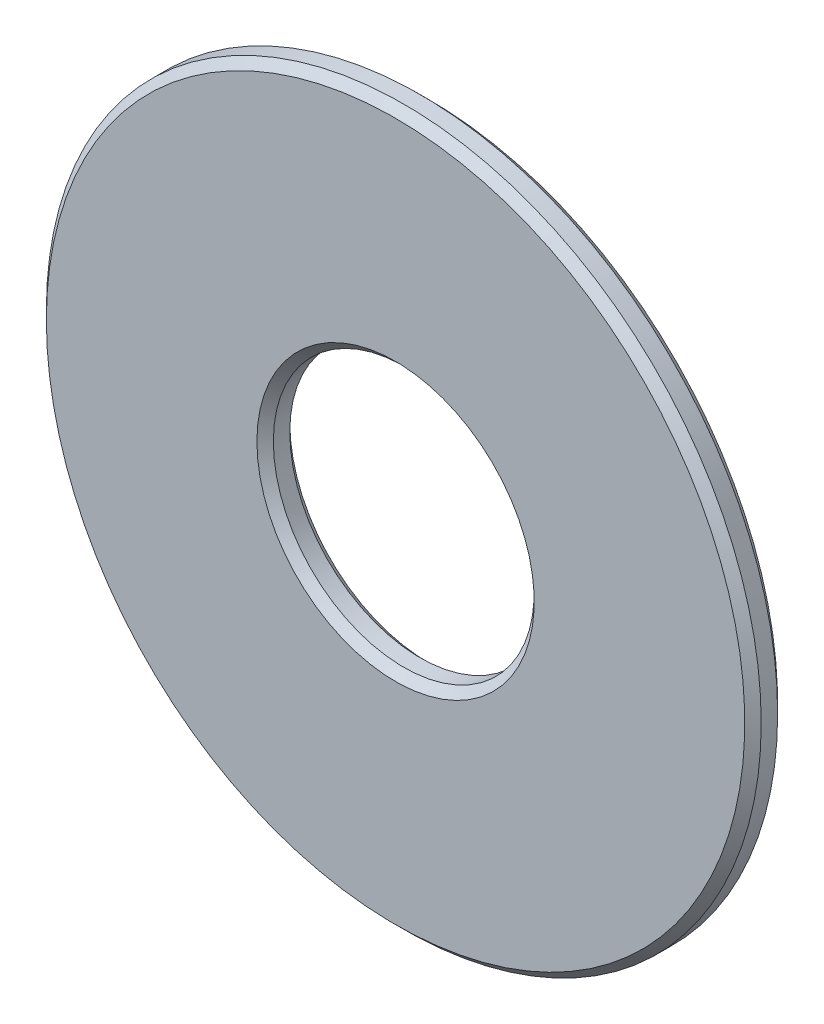
ISO-10303-21;
HEADER;
FILE_DESCRIPTION(('STEP AP214'),'2;1');
FILE_NAME('part.step','',(''),(''),'','','');
FILE_SCHEMA(('AUTOMOTIVE_DESIGN { 1 0 10303 214 1 1 1 1 }'));
ENDSEC;
DATA;
#1=APPLICATION_CONTEXT('core data for automotive mechanical design processes');
#2=APPLICATION_PROTOCOL_DEFINITION('international standard','automotive_design',2000,#1);
#3=PRODUCT_CONTEXT('',#1,'mechanical');
#4=PRODUCT('Part','Part','',(#3));
#5=PRODUCT_RELATED_PRODUCT_CATEGORY('part','',(#4));
#6=PRODUCT_DEFINITION_FORMATION('','',#4);
#7=PRODUCT_DEFINITION_CONTEXT('part definition',#1,'design');
#8=PRODUCT_DEFINITION('design','',#6,#7);
#9=PRODUCT_DEFINITION_SHAPE('','',#8);
#10=(LENGTH_UNIT() NAMED_UNIT(*) SI_UNIT(.MILLI.,.METRE.));
#11=(NAMED_UNIT(*) PLANE_ANGLE_UNIT() SI_UNIT($,.RADIAN.));
#12=(NAMED_UNIT(*) SI_UNIT($,.STERADIAN.) SOLID_ANGLE_UNIT());
#13=UNCERTAINTY_MEASURE_WITH_UNIT(LENGTH_MEASURE(1.E-05),#10,'distance_accuracy_value','');
#14=(GEOMETRIC_REPRESENTATION_CONTEXT(3) GLOBAL_UNCERTAINTY_ASSIGNED_CONTEXT((#13)) GLOBAL_UNIT_ASSIGNED_CONTEXT((#10,
#11,#12)) REPRESENTATION_CONTEXT('',''));
#15=CARTESIAN_POINT('',(0.,0.,0.));
#16=DIRECTION('',(0.,0.,1.));
#17=DIRECTION('',(1.,0.,0.));
#18=AXIS2_PLACEMENT_3D('',#15,#16,#17);
#19=CARTESIAN_POINT('',(86.6025403784436,141.049999999714,366.574757541018));
#20=DIRECTION('',(0.,0.,1.));
#21=DIRECTION('',(-1.,0.,0.));
#22=AXIS2_PLACEMENT_3D('',#19,#20,#21);
#23=CONICAL_SURFACE('',#22,3.375,0.7853981625);
#24=CARTESIAN_POINT('',(86.6025403784436,141.049999999714,366.574757541018));
#25=DIRECTION('',(0.,0.,-1.));
#26=DIRECTION('',(-1.,0.,0.));
#27=AXIS2_PLACEMENT_3D('',#24,#25,#26);
#28=CIRCLE('',#27,3.375);
#29=CARTESIAN_POINT('',(83.2275403784436,141.049999999714,366.574757541018));
#30=VERTEX_POINT('',#29);
#31=EDGE_CURVE('E78',#30,#30,#28,.T.);
#32=ORIENTED_EDGE('',*,*,#31,.F.);
#33=EDGE_LOOP('',(#32));
#34=FACE_BOUND('',#33,.T.);
#35=CARTESIAN_POINT('',(86.6025403784436,141.049999999714,366.374757541018));
#36=DIRECTION('',(0.,0.,1.));
#37=DIRECTION('',(-1.,0.,0.));
#38=AXIS2_PLACEMENT_3D('',#35,#36,#37);
#39=CIRCLE('',#38,3.175);
#40=CARTESIAN_POINT('',(83.4275403784436,141.049999999714,366.374757541018));
#41=VERTEX_POINT('',#40);
#42=EDGE_CURVE('E79',#41,#41,#39,.T.);
#43=ORIENTED_EDGE('',*,*,#42,.F.);
#44=EDGE_LOOP('',(#43));
#45=FACE_BOUND('',#44,.T.);
#46=ADVANCED_FACE('F43',(#34,#45),#23,.F.);
#47=CARTESIAN_POINT('',(86.6025403784436,141.049999999714,366.574757541018));
#48=DIRECTION('',(0.,0.,-1.));
#49=DIRECTION('',(1.,0.,0.));
#50=AXIS2_PLACEMENT_3D('',#47,#48,#49);
#51=CONICAL_SURFACE('',#50,8.5,0.785398162499974);
#52=CARTESIAN_POINT('',(86.6025403784436,141.049999999714,366.574757541018));
#53=DIRECTION('',(0.,0.,1.));
#54=DIRECTION('',(-1.,0.,0.));
#55=AXIS2_PLACEMENT_3D('',#52,#53,#54);
#56=CIRCLE('',#55,8.5);
#57=CARTESIAN_POINT('',(78.1025403784436,141.049999999714,366.574757541018));
#58=VERTEX_POINT('',#57);
#59=EDGE_CURVE('E75',#58,#58,#56,.T.);
#60=ORIENTED_EDGE('',*,*,#59,.F.);
#61=EDGE_LOOP('',(#60));
#62=FACE_BOUND('',#61,.T.);
#63=CARTESIAN_POINT('',(86.6025403784436,141.049999999714,366.374757541018));
#64=DIRECTION('',(0.,0.,-1.));
#65=DIRECTION('',(-1.,0.,0.));
#66=AXIS2_PLACEMENT_3D('',#63,#64,#65);
#67=CIRCLE('',#66,8.7);
#68=CARTESIAN_POINT('',(77.9025403784436,141.049999999714,366.374757541018));
#69=VERTEX_POINT('',#68);
#70=EDGE_CURVE('E86',#69,#69,#67,.T.);
#71=ORIENTED_EDGE('',*,*,#70,.F.);
#72=EDGE_LOOP('',(#71));
#73=FACE_BOUND('',#72,.T.);
#74=ADVANCED_FACE('F104',(#62,#73),#51,.T.);
#75=CARTESIAN_POINT('',(86.6025403784436,141.049999999714,365.974757541019));
#76=DIRECTION('',(0.,0.,-1.));
#77=DIRECTION('',(1.,0.,0.));
#78=AXIS2_PLACEMENT_3D('',#75,#76,#77);
#79=CONICAL_SURFACE('',#78,3.175,0.7853981625);
#80=CARTESIAN_POINT('',(86.6025403784436,141.049999999714,365.974757541019));
#81=DIRECTION('',(0.,0.,-1.));
#82=DIRECTION('',(-1.,0.,0.));
#83=AXIS2_PLACEMENT_3D('',#80,#81,#82);
#84=CIRCLE('',#83,3.175);
#85=CARTESIAN_POINT('',(83.4275403784436,141.049999999714,365.974757541019));
#86=VERTEX_POINT('',#85);
#87=EDGE_CURVE('E82',#86,#86,#84,.T.);
#88=ORIENTED_EDGE('',*,*,#87,.F.);
#89=EDGE_LOOP('',(#88));
#90=FACE_BOUND('',#89,.T.);
#91=CARTESIAN_POINT('',(86.6025403784436,141.049999999714,365.774757541019));
#92=DIRECTION('',(0.,0.,1.));
#93=DIRECTION('',(-1.,0.,0.));
#94=AXIS2_PLACEMENT_3D('',#91,#92,#93);
#95=CIRCLE('',#94,3.375);
#96=CARTESIAN_POINT('',(83.2275403784436,141.049999999714,365.774757541019));
#97=VERTEX_POINT('',#96);
#98=EDGE_CURVE('E11',#97,#97,#95,.T.);
#99=ORIENTED_EDGE('',*,*,#98,.F.);
#100=EDGE_LOOP('',(#99));
#101=FACE_BOUND('',#100,.T.);
#102=ADVANCED_FACE('F95',(#90,#101),#79,.F.);
#103=CARTESIAN_POINT('',(86.6025403784436,141.049999999714,365.974757541019));
#104=DIRECTION('',(0.,0.,1.));
#105=DIRECTION('',(-1.,0.,0.));
#106=AXIS2_PLACEMENT_3D('',#103,#104,#105);
#107=CONICAL_SURFACE('',#106,8.7,0.785398162499974);
#108=CARTESIAN_POINT('',(86.6025403784436,141.049999999714,365.974757541019));
#109=DIRECTION('',(0.,0.,1.));
#110=DIRECTION('',(-1.,0.,0.));
#111=AXIS2_PLACEMENT_3D('',#108,#109,#110);
#112=CIRCLE('',#111,8.7);
#113=CARTESIAN_POINT('',(77.9025403784436,141.049999999714,365.974757541019));
#114=VERTEX_POINT('',#113);
#115=EDGE_CURVE('E47',#114,#114,#112,.T.);
#116=ORIENTED_EDGE('',*,*,#115,.F.);
#117=EDGE_LOOP('',(#116));
#118=FACE_BOUND('',#117,.T.);
#119=CARTESIAN_POINT('',(86.6025403784436,141.049999999714,365.774757541019));
#120=DIRECTION('',(0.,0.,-1.));
#121=DIRECTION('',(-1.,0.,0.));
#122=AXIS2_PLACEMENT_3D('',#119,#120,#121);
#123=CIRCLE('',#122,8.5);
#124=CARTESIAN_POINT('',(78.1025403784436,141.049999999714,365.774757541019));
#125=VERTEX_POINT('',#124);
#126=EDGE_CURVE('E53',#125,#125,#123,.T.);
#127=ORIENTED_EDGE('',*,*,#126,.F.);
#128=EDGE_LOOP('',(#127));
#129=FACE_BOUND('',#128,.T.);
#130=ADVANCED_FACE('F93',(#118,#129),#107,.T.);
#131=CARTESIAN_POINT('',(86.6025403784436,141.049999999714,365.774757541019));
#132=DIRECTION('',(0.,0.,1.));
#133=DIRECTION('',(1.,0.,0.));
#134=AXIS2_PLACEMENT_3D('',#131,#132,#133);
#135=PLANE('',#134);
#136=ORIENTED_EDGE('',*,*,#98,.T.);
#137=EDGE_LOOP('',(#136));
#138=FACE_BOUND('',#137,.T.);
#139=ORIENTED_EDGE('',*,*,#126,.T.);
#140=EDGE_LOOP('',(#139));
#141=FACE_BOUND('',#140,.T.);
#142=ADVANCED_FACE('F91',(#138,#141),#135,.F.);
#143=CARTESIAN_POINT('',(86.6025403784436,141.049999999714,366.574757541018));
#144=DIRECTION('',(0.,0.,1.));
#145=DIRECTION('',(1.,0.,0.));
#146=AXIS2_PLACEMENT_3D('',#143,#144,#145);
#147=PLANE('',#146);
#148=ORIENTED_EDGE('',*,*,#31,.T.);
#149=EDGE_LOOP('',(#148));
#150=FACE_BOUND('',#149,.T.);
#151=ORIENTED_EDGE('',*,*,#59,.T.);
#152=EDGE_LOOP('',(#151));
#153=FACE_BOUND('',#152,.T.);
#154=ADVANCED_FACE('F76',(#150,#153),#147,.T.);
#155=CARTESIAN_POINT('',(86.6025403784436,141.049999999714,366.574757541018));
#156=DIRECTION('',(0.,0.,-1.));
#157=DIRECTION('',(1.,0.,0.));
#158=AXIS2_PLACEMENT_3D('',#155,#156,#157);
#159=CYLINDRICAL_SURFACE('',#158,3.175);
#160=ORIENTED_EDGE('',*,*,#42,.T.);
#161=EDGE_LOOP('',(#160));
#162=FACE_BOUND('',#161,.T.);
#163=ORIENTED_EDGE('',*,*,#87,.T.);
#164=EDGE_LOOP('',(#163));
#165=FACE_BOUND('',#164,.T.);
#166=ADVANCED_FACE('F120',(#162,#165),#159,.F.);
#167=CARTESIAN_POINT('',(86.6025403784436,141.049999999714,366.574757541018));
#168=DIRECTION('',(0.,0.,-1.));
#169=DIRECTION('',(1.,0.,0.));
#170=AXIS2_PLACEMENT_3D('',#167,#168,#169);
#171=CYLINDRICAL_SURFACE('',#170,8.7);
#172=ORIENTED_EDGE('',*,*,#70,.T.);
#173=EDGE_LOOP('',(#172));
#174=FACE_BOUND('',#173,.T.);
#175=ORIENTED_EDGE('',*,*,#115,.T.);
#176=EDGE_LOOP('',(#175));
#177=FACE_BOUND('',#176,.T.);
#178=ADVANCED_FACE('F45',(#174,#177),#171,.T.);
#179=CLOSED_SHELL('',(#46,#74,#102,#130,#142,#154,#166,#178));
#180=MANIFOLD_SOLID_BREP('B2',#179);
#181=ADVANCED_BREP_SHAPE_REPRESENTATION('',(#18,#180),#14);
#182=SHAPE_DEFINITION_REPRESENTATION(#9,#181);
ENDSEC;
END-ISO-10303-21;
